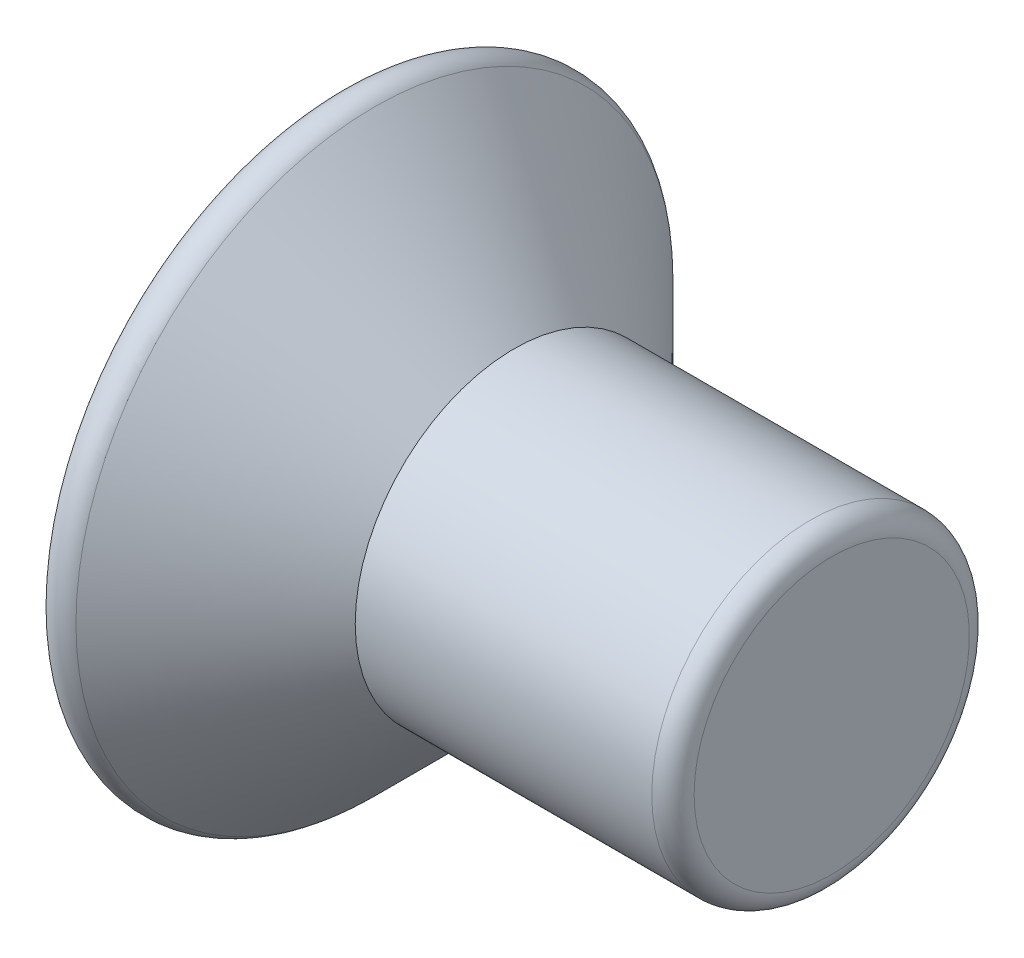
ISO-10303-21;
HEADER;
FILE_DESCRIPTION(('STEP AP214'),'2;1');
FILE_NAME('part.step','',(''),(''),'','','');
FILE_SCHEMA(('AUTOMOTIVE_DESIGN { 1 0 10303 214 1 1 1 1 }'));
ENDSEC;
DATA;
#1=APPLICATION_CONTEXT('core data for automotive mechanical design processes');
#2=APPLICATION_PROTOCOL_DEFINITION('international standard','automotive_design',2000,#1);
#3=PRODUCT_CONTEXT('',#1,'mechanical');
#4=PRODUCT('Part','Part','',(#3));
#5=PRODUCT_RELATED_PRODUCT_CATEGORY('part','',(#4));
#6=PRODUCT_DEFINITION_FORMATION('','',#4);
#7=PRODUCT_DEFINITION_CONTEXT('part definition',#1,'design');
#8=PRODUCT_DEFINITION('design','',#6,#7);
#9=PRODUCT_DEFINITION_SHAPE('','',#8);
#10=(LENGTH_UNIT() NAMED_UNIT(*) SI_UNIT(.MILLI.,.METRE.));
#11=(NAMED_UNIT(*) PLANE_ANGLE_UNIT() SI_UNIT($,.RADIAN.));
#12=(NAMED_UNIT(*) SI_UNIT($,.STERADIAN.) SOLID_ANGLE_UNIT());
#13=UNCERTAINTY_MEASURE_WITH_UNIT(LENGTH_MEASURE(1.E-05),#10,'distance_accuracy_value','');
#14=(GEOMETRIC_REPRESENTATION_CONTEXT(3) GLOBAL_UNCERTAINTY_ASSIGNED_CONTEXT((#13)) GLOBAL_UNIT_ASSIGNED_CONTEXT((#10,
#11,#12)) REPRESENTATION_CONTEXT('',''));
#15=CARTESIAN_POINT('',(0.,0.,0.));
#16=DIRECTION('',(0.,0.,1.));
#17=DIRECTION('',(1.,0.,0.));
#18=AXIS2_PLACEMENT_3D('',#15,#16,#17);
#19=CARTESIAN_POINT('',(0.,0.,0.));
#20=DIRECTION('',(1.,0.,0.));
#21=DIRECTION('',(0.,0.,-1.));
#22=AXIS2_PLACEMENT_3D('',#19,#20,#21);
#23=PLANE('',#22);
#24=CARTESIAN_POINT('',(0.,0.,0.));
#25=DIRECTION('',(1.,0.,0.));
#26=DIRECTION('',(0.,0.,-1.));
#27=AXIS2_PLACEMENT_3D('',#24,#25,#26);
#28=CIRCLE('',#27,2.67715728752538);
#29=CARTESIAN_POINT('',(0.,0.,-2.67715728752538));
#30=VERTEX_POINT('',#29);
#31=EDGE_CURVE('E50',#30,#30,#28,.F.);
#32=ORIENTED_EDGE('',*,*,#31,.T.);
#33=EDGE_LOOP('',(#32));
#34=FACE_BOUND('',#33,.T.);
#35=DIRECTION('',(0.,0.5,0.866025403784439));
#36=VECTOR('',#35,1.);
#37=CARTESIAN_POINT('',(0.,-1.1,0.));
#38=LINE('',#37,#36);
#39=CARTESIAN_POINT('',(0.,-1.1,0.));
#40=VERTEX_POINT('',#39);
#41=CARTESIAN_POINT('',(0.,-0.55,0.952627944162882));
#42=VERTEX_POINT('',#41);
#43=EDGE_CURVE('E137',#40,#42,#38,.T.);
#44=ORIENTED_EDGE('',*,*,#43,.F.);
#45=DIRECTION('',(0.,-0.5,0.866025403784439));
#46=VECTOR('',#45,1.);
#47=CARTESIAN_POINT('',(0.,-0.55,-0.952627944162883));
#48=LINE('',#47,#46);
#49=CARTESIAN_POINT('',(0.,-0.55,-0.952627944162883));
#50=VERTEX_POINT('',#49);
#51=EDGE_CURVE('E57',#50,#40,#48,.T.);
#52=ORIENTED_EDGE('',*,*,#51,.F.);
#53=DIRECTION('',(0.,-1.,0.));
#54=VECTOR('',#53,1.);
#55=CARTESIAN_POINT('',(0.,0.55,-0.952627944162882));
#56=LINE('',#55,#54);
#57=CARTESIAN_POINT('',(0.,0.55,-0.952627944162882));
#58=VERTEX_POINT('',#57);
#59=EDGE_CURVE('E150',#58,#50,#56,.T.);
#60=ORIENTED_EDGE('',*,*,#59,.F.);
#61=DIRECTION('',(0.,-0.5,-0.866025403784439));
#62=VECTOR('',#61,1.);
#63=CARTESIAN_POINT('',(0.,1.1,0.));
#64=LINE('',#63,#62);
#65=CARTESIAN_POINT('',(0.,1.1,0.));
#66=VERTEX_POINT('',#65);
#67=EDGE_CURVE('E147',#66,#58,#64,.T.);
#68=ORIENTED_EDGE('',*,*,#67,.F.);
#69=DIRECTION('',(0.,0.5,-0.866025403784439));
#70=VECTOR('',#69,1.);
#71=CARTESIAN_POINT('',(0.,0.550000000000001,0.952627944162882));
#72=LINE('',#71,#70);
#73=CARTESIAN_POINT('',(0.,0.550000000000001,0.952627944162882));
#74=VERTEX_POINT('',#73);
#75=EDGE_CURVE('E105',#74,#66,#72,.T.);
#76=ORIENTED_EDGE('',*,*,#75,.F.);
#77=DIRECTION('',(0.,1.,0.));
#78=VECTOR('',#77,1.);
#79=CARTESIAN_POINT('',(0.,-0.55,0.952627944162882));
#80=LINE('',#79,#78);
#81=EDGE_CURVE('E141',#42,#74,#80,.T.);
#82=ORIENTED_EDGE('',*,*,#81,.F.);
#83=EDGE_LOOP('',(#44,#52,#60,#68,#76,#82));
#84=FACE_BOUND('',#83,.T.);
#85=ADVANCED_FACE('F41',(#34,#84),#23,.F.);
#86=CARTESIAN_POINT('',(1.66,0.,0.));
#87=DIRECTION('',(-1.,0.,0.));
#88=DIRECTION('',(0.,0.,1.));
#89=AXIS2_PLACEMENT_3D('',#86,#87,#88);
#90=CONICAL_SURFACE('',#89,1.49999999999998,0.785398163397453);
#91=CARTESIAN_POINT('',(0.341421356237311,0.,0.));
#92=DIRECTION('',(1.,0.,0.));
#93=DIRECTION('',(0.,0.,-1.));
#94=AXIS2_PLACEMENT_3D('',#91,#92,#93);
#95=CIRCLE('',#94,2.81857864376269);
#96=CARTESIAN_POINT('',(0.341421356237311,0.,-2.81857864376269));
#97=VERTEX_POINT('',#96);
#98=EDGE_CURVE('E11',#97,#97,#95,.T.);
#99=ORIENTED_EDGE('',*,*,#98,.T.);
#100=EDGE_LOOP('',(#99));
#101=FACE_BOUND('',#100,.T.);
#102=CARTESIAN_POINT('',(1.66,0.,0.));
#103=DIRECTION('',(-1.,0.,0.));
#104=DIRECTION('',(0.,0.,1.));
#105=AXIS2_PLACEMENT_3D('',#102,#103,#104);
#106=CIRCLE('',#105,1.49999999999998);
#107=CARTESIAN_POINT('',(1.66,0.,1.49999999999998));
#108=VERTEX_POINT('',#107);
#109=EDGE_CURVE('E156',#108,#108,#106,.T.);
#110=ORIENTED_EDGE('',*,*,#109,.T.);
#111=EDGE_LOOP('',(#110));
#112=FACE_BOUND('',#111,.T.);
#113=ADVANCED_FACE('F191',(#101,#112),#90,.T.);
#114=CARTESIAN_POINT('',(-5.76894587386338,0.,0.));
#115=DIRECTION('',(-1.,0.,0.));
#116=DIRECTION('',(0.,0.,1.));
#117=AXIS2_PLACEMENT_3D('',#114,#115,#116);
#118=CYLINDRICAL_SURFACE('',#117,1.49999999999998);
#119=CARTESIAN_POINT('',(4.46,0.,0.));
#120=DIRECTION('',(-1.,0.,0.));
#121=DIRECTION('',(0.,0.,1.));
#122=AXIS2_PLACEMENT_3D('',#119,#120,#121);
#123=CIRCLE('',#122,1.49999999999998);
#124=CARTESIAN_POINT('',(4.46,0.,1.49999999999998));
#125=VERTEX_POINT('',#124);
#126=EDGE_CURVE('E169',#125,#125,#123,.T.);
#127=ORIENTED_EDGE('',*,*,#126,.T.);
#128=EDGE_LOOP('',(#127));
#129=FACE_BOUND('',#128,.T.);
#130=ORIENTED_EDGE('',*,*,#109,.F.);
#131=EDGE_LOOP('',(#130));
#132=FACE_BOUND('',#131,.T.);
#133=ADVANCED_FACE('F196',(#129,#132),#118,.T.);
#134=CARTESIAN_POINT('',(4.66,1.49999999999998,0.));
#135=DIRECTION('',(-1.,0.,0.));
#136=DIRECTION('',(0.,0.,1.));
#137=AXIS2_PLACEMENT_3D('',#134,#135,#136);
#138=PLANE('',#137);
#139=CARTESIAN_POINT('',(4.66,0.,0.));
#140=DIRECTION('',(-1.,0.,0.));
#141=DIRECTION('',(0.,0.,1.));
#142=AXIS2_PLACEMENT_3D('',#139,#140,#141);
#143=CIRCLE('',#142,1.29999999999998);
#144=CARTESIAN_POINT('',(4.66,0.,1.29999999999998));
#145=VERTEX_POINT('',#144);
#146=EDGE_CURVE('E173',#145,#145,#143,.F.);
#147=ORIENTED_EDGE('',*,*,#146,.T.);
#148=EDGE_LOOP('',(#147));
#149=FACE_BOUND('',#148,.T.);
#150=ADVANCED_FACE('F202',(#149),#138,.F.);
#151=CARTESIAN_POINT('',(0.1,-0.55,-0.952627944162883));
#152=DIRECTION('',(0.,-0.866025403784439,-0.5));
#153=DIRECTION('',(0.,0.5,-0.866025403784439));
#154=AXIS2_PLACEMENT_3D('',#151,#152,#153);
#155=PLANE('',#154);
#156=ORIENTED_EDGE('',*,*,#51,.T.);
#157=DIRECTION('',(-1.,0.,0.));
#158=VECTOR('',#157,1.);
#159=CARTESIAN_POINT('',(0.1,-1.1,0.));
#160=LINE('',#159,#158);
#161=CARTESIAN_POINT('',(0.1,-1.1,0.));
#162=VERTEX_POINT('',#161);
#163=EDGE_CURVE('E87',#162,#40,#160,.T.);
#164=ORIENTED_EDGE('',*,*,#163,.F.);
#165=DIRECTION('',(0.,-0.5,0.866025403784439));
#166=VECTOR('',#165,1.);
#167=CARTESIAN_POINT('',(0.1,-0.55,-0.952627944162883));
#168=LINE('',#167,#166);
#169=CARTESIAN_POINT('',(0.1,-0.55,-0.952627944162883));
#170=VERTEX_POINT('',#169);
#171=EDGE_CURVE('E153',#170,#162,#168,.T.);
#172=ORIENTED_EDGE('',*,*,#171,.F.);
#173=DIRECTION('',(-1.,0.,0.));
#174=VECTOR('',#173,1.);
#175=CARTESIAN_POINT('',(0.1,-0.55,-0.952627944162883));
#176=LINE('',#175,#174);
#177=EDGE_CURVE('E65',#170,#50,#176,.T.);
#178=ORIENTED_EDGE('',*,*,#177,.T.);
#179=EDGE_LOOP('',(#156,#164,#172,#178));
#180=FACE_BOUND('',#179,.T.);
#181=ADVANCED_FACE('F206',(#180),#155,.F.);
#182=CARTESIAN_POINT('',(0.1,0.55,-0.952627944162882));
#183=DIRECTION('',(0.,0.,-1.));
#184=DIRECTION('',(0.,1.,0.));
#185=AXIS2_PLACEMENT_3D('',#182,#183,#184);
#186=PLANE('',#185);
#187=ORIENTED_EDGE('',*,*,#59,.T.);
#188=ORIENTED_EDGE('',*,*,#177,.F.);
#189=DIRECTION('',(0.,-1.,0.));
#190=VECTOR('',#189,1.);
#191=CARTESIAN_POINT('',(0.1,0.55,-0.952627944162882));
#192=LINE('',#191,#190);
#193=CARTESIAN_POINT('',(0.1,0.55,-0.952627944162882));
#194=VERTEX_POINT('',#193);
#195=EDGE_CURVE('E119',#194,#170,#192,.T.);
#196=ORIENTED_EDGE('',*,*,#195,.F.);
#197=DIRECTION('',(-1.,0.,0.));
#198=VECTOR('',#197,1.);
#199=CARTESIAN_POINT('',(0.1,0.55,-0.952627944162882));
#200=LINE('',#199,#198);
#201=EDGE_CURVE('E110',#194,#58,#200,.T.);
#202=ORIENTED_EDGE('',*,*,#201,.T.);
#203=EDGE_LOOP('',(#187,#188,#196,#202));
#204=FACE_BOUND('',#203,.T.);
#205=ADVANCED_FACE('F210',(#204),#186,.F.);
#206=CARTESIAN_POINT('',(0.1,1.1,0.));
#207=DIRECTION('',(0.,0.866025403784439,-0.5));
#208=DIRECTION('',(0.,0.5,0.866025403784439));
#209=AXIS2_PLACEMENT_3D('',#206,#207,#208);
#210=PLANE('',#209);
#211=ORIENTED_EDGE('',*,*,#67,.T.);
#212=ORIENTED_EDGE('',*,*,#201,.F.);
#213=DIRECTION('',(0.,-0.5,-0.866025403784439));
#214=VECTOR('',#213,1.);
#215=CARTESIAN_POINT('',(0.1,1.1,0.));
#216=LINE('',#215,#214);
#217=CARTESIAN_POINT('',(0.1,1.1,0.));
#218=VERTEX_POINT('',#217);
#219=EDGE_CURVE('E114',#218,#194,#216,.T.);
#220=ORIENTED_EDGE('',*,*,#219,.F.);
#221=DIRECTION('',(-1.,0.,0.));
#222=VECTOR('',#221,1.);
#223=CARTESIAN_POINT('',(0.1,1.1,0.));
#224=LINE('',#223,#222);
#225=EDGE_CURVE('E98',#218,#66,#224,.T.);
#226=ORIENTED_EDGE('',*,*,#225,.T.);
#227=EDGE_LOOP('',(#211,#212,#220,#226));
#228=FACE_BOUND('',#227,.T.);
#229=ADVANCED_FACE('F115',(#228),#210,.F.);
#230=CARTESIAN_POINT('',(0.1,0.550000000000001,0.952627944162882));
#231=DIRECTION('',(0.,0.866025403784439,0.5));
#232=DIRECTION('',(0.,-0.5,0.866025403784439));
#233=AXIS2_PLACEMENT_3D('',#230,#231,#232);
#234=PLANE('',#233);
#235=ORIENTED_EDGE('',*,*,#75,.T.);
#236=ORIENTED_EDGE('',*,*,#225,.F.);
#237=DIRECTION('',(0.,0.5,-0.866025403784439));
#238=VECTOR('',#237,1.);
#239=CARTESIAN_POINT('',(0.1,0.550000000000001,0.952627944162882));
#240=LINE('',#239,#238);
#241=CARTESIAN_POINT('',(0.1,0.550000000000001,0.952627944162882));
#242=VERTEX_POINT('',#241);
#243=EDGE_CURVE('E102',#242,#218,#240,.T.);
#244=ORIENTED_EDGE('',*,*,#243,.F.);
#245=DIRECTION('',(-1.,0.,0.));
#246=VECTOR('',#245,1.);
#247=CARTESIAN_POINT('',(0.1,0.550000000000001,0.952627944162882));
#248=LINE('',#247,#246);
#249=EDGE_CURVE('E111',#242,#74,#248,.T.);
#250=ORIENTED_EDGE('',*,*,#249,.T.);
#251=EDGE_LOOP('',(#235,#236,#244,#250));
#252=FACE_BOUND('',#251,.T.);
#253=ADVANCED_FACE('F100',(#252),#234,.F.);
#254=CARTESIAN_POINT('',(0.1,-0.55,0.952627944162882));
#255=DIRECTION('',(0.,0.,1.));
#256=DIRECTION('',(1.,0.,0.));
#257=AXIS2_PLACEMENT_3D('',#254,#255,#256);
#258=PLANE('',#257);
#259=ORIENTED_EDGE('',*,*,#81,.T.);
#260=ORIENTED_EDGE('',*,*,#249,.F.);
#261=DIRECTION('',(0.,1.,0.));
#262=VECTOR('',#261,1.);
#263=CARTESIAN_POINT('',(0.1,-0.55,0.952627944162882));
#264=LINE('',#263,#262);
#265=CARTESIAN_POINT('',(0.1,-0.55,0.952627944162882));
#266=VERTEX_POINT('',#265);
#267=EDGE_CURVE('E125',#266,#242,#264,.T.);
#268=ORIENTED_EDGE('',*,*,#267,.F.);
#269=DIRECTION('',(-1.,0.,0.));
#270=VECTOR('',#269,1.);
#271=CARTESIAN_POINT('',(0.1,-0.55,0.952627944162882));
#272=LINE('',#271,#270);
#273=EDGE_CURVE('E161',#266,#42,#272,.T.);
#274=ORIENTED_EDGE('',*,*,#273,.T.);
#275=EDGE_LOOP('',(#259,#260,#268,#274));
#276=FACE_BOUND('',#275,.T.);
#277=ADVANCED_FACE('F214',(#276),#258,.F.);
#278=CARTESIAN_POINT('',(0.1,-1.1,0.));
#279=DIRECTION('',(0.,-0.866025403784439,0.5));
#280=DIRECTION('',(0.,-0.5,-0.866025403784439));
#281=AXIS2_PLACEMENT_3D('',#278,#279,#280);
#282=PLANE('',#281);
#283=ORIENTED_EDGE('',*,*,#43,.T.);
#284=ORIENTED_EDGE('',*,*,#273,.F.);
#285=DIRECTION('',(0.,0.5,0.866025403784439));
#286=VECTOR('',#285,1.);
#287=CARTESIAN_POINT('',(0.1,-1.1,0.));
#288=LINE('',#287,#286);
#289=EDGE_CURVE('E129',#162,#266,#288,.T.);
#290=ORIENTED_EDGE('',*,*,#289,.F.);
#291=ORIENTED_EDGE('',*,*,#163,.T.);
#292=EDGE_LOOP('',(#283,#284,#290,#291));
#293=FACE_BOUND('',#292,.T.);
#294=ADVANCED_FACE('F211',(#293),#282,.F.);
#295=CARTESIAN_POINT('',(0.1,0.,0.));
#296=DIRECTION('',(-1.,0.,0.));
#297=DIRECTION('',(0.,0.,1.));
#298=AXIS2_PLACEMENT_3D('',#295,#296,#297);
#299=PLANE('',#298);
#300=ORIENTED_EDGE('',*,*,#171,.T.);
#301=ORIENTED_EDGE('',*,*,#289,.T.);
#302=ORIENTED_EDGE('',*,*,#267,.T.);
#303=ORIENTED_EDGE('',*,*,#243,.T.);
#304=ORIENTED_EDGE('',*,*,#219,.T.);
#305=ORIENTED_EDGE('',*,*,#195,.T.);
#306=EDGE_LOOP('',(#300,#301,#302,#303,#304,#305));
#307=FACE_BOUND('',#306,.T.);
#308=ADVANCED_FACE('F122',(#307),#299,.T.);
#309=CARTESIAN_POINT('',(4.46,0.,0.));
#310=DIRECTION('',(-1.,0.,0.));
#311=DIRECTION('',(0.,0.,1.));
#312=AXIS2_PLACEMENT_3D('',#309,#310,#311);
#313=TOROIDAL_SURFACE('',#312,1.29999999999998,0.2);
#314=ORIENTED_EDGE('',*,*,#146,.F.);
#315=EDGE_LOOP('',(#314));
#316=FACE_BOUND('',#315,.T.);
#317=ORIENTED_EDGE('',*,*,#126,.F.);
#318=EDGE_LOOP('',(#317));
#319=FACE_BOUND('',#318,.T.);
#320=ADVANCED_FACE('F183',(#316,#319),#313,.T.);
#321=CARTESIAN_POINT('',(0.2,0.,0.));
#322=DIRECTION('',(1.,0.,0.));
#323=DIRECTION('',(0.,0.,-1.));
#324=AXIS2_PLACEMENT_3D('',#321,#322,#323);
#325=TOROIDAL_SURFACE('',#324,2.67715728752538,0.2);
#326=ORIENTED_EDGE('',*,*,#98,.F.);
#327=EDGE_LOOP('',(#326));
#328=FACE_BOUND('',#327,.T.);
#329=ORIENTED_EDGE('',*,*,#31,.F.);
#330=EDGE_LOOP('',(#329));
#331=FACE_BOUND('',#330,.T.);
#332=ADVANCED_FACE('F43',(#328,#331),#325,.T.);
#333=CLOSED_SHELL('',(#85,#113,#133,#150,#181,#205,#229,#253,#277,#294,#308,#320,#332));
#334=MANIFOLD_SOLID_BREP('B2',#333);
#335=ADVANCED_BREP_SHAPE_REPRESENTATION('',(#18,#334),#14);
#336=SHAPE_DEFINITION_REPRESENTATION(#9,#335);
ENDSEC;
END-ISO-10303-21;
